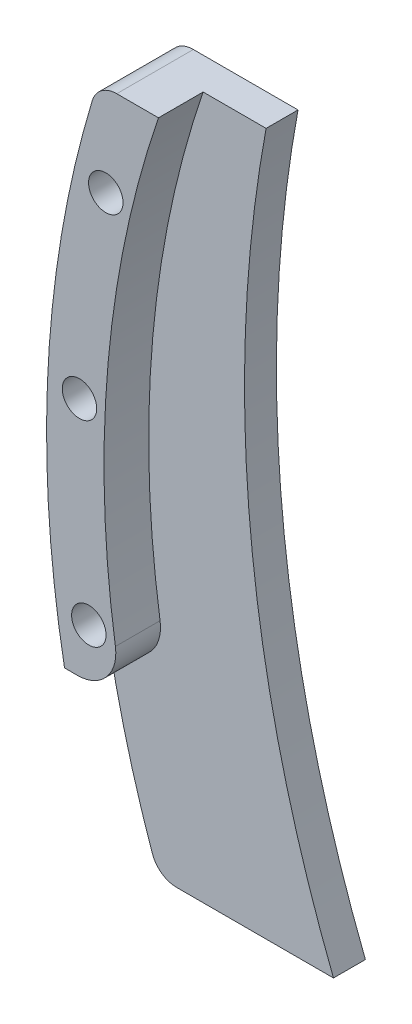
ISO-10303-21;
HEADER;
FILE_DESCRIPTION(('STEP AP214'),'2;1');
FILE_NAME('part.step','',(''),(''),'','','');
FILE_SCHEMA(('AUTOMOTIVE_DESIGN { 1 0 10303 214 1 1 1 1 }'));
ENDSEC;
DATA;
#1=APPLICATION_CONTEXT('core data for automotive mechanical design processes');
#2=APPLICATION_PROTOCOL_DEFINITION('international standard','automotive_design',2000,#1);
#3=PRODUCT_CONTEXT('',#1,'mechanical');
#4=PRODUCT('Part','Part','',(#3));
#5=PRODUCT_RELATED_PRODUCT_CATEGORY('part','',(#4));
#6=PRODUCT_DEFINITION_FORMATION('','',#4);
#7=PRODUCT_DEFINITION_CONTEXT('part definition',#1,'design');
#8=PRODUCT_DEFINITION('design','',#6,#7);
#9=PRODUCT_DEFINITION_SHAPE('','',#8);
#10=(LENGTH_UNIT() NAMED_UNIT(*) SI_UNIT(.MILLI.,.METRE.));
#11=(NAMED_UNIT(*) PLANE_ANGLE_UNIT() SI_UNIT($,.RADIAN.));
#12=(NAMED_UNIT(*) SI_UNIT($,.STERADIAN.) SOLID_ANGLE_UNIT());
#13=UNCERTAINTY_MEASURE_WITH_UNIT(LENGTH_MEASURE(1.E-05),#10,'distance_accuracy_value','');
#14=(GEOMETRIC_REPRESENTATION_CONTEXT(3) GLOBAL_UNCERTAINTY_ASSIGNED_CONTEXT((#13)) GLOBAL_UNIT_ASSIGNED_CONTEXT((#10,
#11,#12)) REPRESENTATION_CONTEXT('',''));
#15=CARTESIAN_POINT('',(0.,0.,0.));
#16=DIRECTION('',(0.,0.,1.));
#17=DIRECTION('',(1.,0.,0.));
#18=AXIS2_PLACEMENT_3D('',#15,#16,#17);
#19=CARTESIAN_POINT('',(0.,34.5634076532497,7.));
#20=DIRECTION('',(0.,1.,0.));
#21=DIRECTION('',(-1.,0.,0.));
#22=AXIS2_PLACEMENT_3D('',#19,#20,#21);
#23=PLANE('',#22);
#24=DIRECTION('',(-1.,0.,0.));
#25=VECTOR('',#24,1.);
#26=CARTESIAN_POINT('',(0.,34.5634076532497,-2.5));
#27=LINE('',#26,#25);
#28=CARTESIAN_POINT('',(1.32762574070365,34.5634076532497,-2.5));
#29=VERTEX_POINT('',#28);
#30=CARTESIAN_POINT('',(-10.9648148090118,34.5634076532497,-2.5));
#31=VERTEX_POINT('',#30);
#32=EDGE_CURVE('E170',#29,#31,#27,.T.);
#33=ORIENTED_EDGE('',*,*,#32,.T.);
#34=DIRECTION('',(0.,0.,1.));
#35=VECTOR('',#34,1.);
#36=CARTESIAN_POINT('',(-10.9648148090118,34.5634076532497,0.));
#37=LINE('',#36,#35);
#38=CARTESIAN_POINT('',(-10.9648148090118,34.5634076532497,-5.));
#39=VERTEX_POINT('',#38);
#40=EDGE_CURVE('E202',#31,#39,#37,.F.);
#41=ORIENTED_EDGE('',*,*,#40,.T.);
#42=DIRECTION('',(-1.,0.,0.));
#43=VECTOR('',#42,1.);
#44=CARTESIAN_POINT('',(0.,34.5634076532497,-5.));
#45=LINE('',#44,#43);
#46=CARTESIAN_POINT('',(1.32762574070365,34.5634076532497,-5.));
#47=VERTEX_POINT('',#46);
#48=EDGE_CURVE('E183',#47,#39,#45,.T.);
#49=ORIENTED_EDGE('',*,*,#48,.F.);
#50=DIRECTION('',(0.,0.,-1.));
#51=VECTOR('',#50,1.);
#52=CARTESIAN_POINT('',(1.32762574070365,34.5634076532497,-2.5));
#53=LINE('',#52,#51);
#54=EDGE_CURVE('E177',#29,#47,#53,.T.);
#55=ORIENTED_EDGE('',*,*,#54,.F.);
#56=EDGE_LOOP('',(#33,#41,#49,#55));
#57=FACE_BOUND('',#56,.T.);
#58=ADVANCED_FACE('F45',(#57),#23,.F.);
#59=CARTESIAN_POINT('',(66.3533376194957,63.8746380364105,63.0195151716117));
#60=DIRECTION('',(0.,0.,-1.));
#61=DIRECTION('',(-1.,0.,0.));
#62=AXIS2_PLACEMENT_3D('',#59,#60,#61);
#63=CYLINDRICAL_SURFACE('',#62,84.);
#64=DIRECTION('',(0.,0.,-1.));
#65=VECTOR('',#64,1.);
#66=CARTESIAN_POINT('',(-12.850623404829,35.8972800829287,63.0195151716117));
#67=LINE('',#66,#65);
#68=CARTESIAN_POINT('',(-12.850623404829,35.8972800829287,-5.));
#69=VERTEX_POINT('',#68);
#70=CARTESIAN_POINT('',(-12.8506234048291,35.8972800829287,-2.5));
#71=VERTEX_POINT('',#70);
#72=EDGE_CURVE('E206',#69,#71,#67,.F.);
#73=ORIENTED_EDGE('',*,*,#72,.T.);
#74=CARTESIAN_POINT('',(66.3533376194957,63.8746380364105,-2.5));
#75=DIRECTION('',(0.,0.,1.));
#76=DIRECTION('',(1.,0.,0.));
#77=AXIS2_PLACEMENT_3D('',#74,#75,#76);
#78=CIRCLE('',#77,84.);
#79=CARTESIAN_POINT('',(-16.2394358183407,48.5634076532497,-2.5));
#80=VERTEX_POINT('',#79);
#81=EDGE_CURVE('E127',#80,#71,#78,.T.);
#82=ORIENTED_EDGE('',*,*,#81,.F.);
#83=DIRECTION('',(0.,0.,-1.));
#84=VECTOR('',#83,1.);
#85=CARTESIAN_POINT('',(-16.2394358183407,48.5634076532497,16.4795946919343));
#86=LINE('',#85,#84);
#87=CARTESIAN_POINT('',(-16.2394358183407,48.5634076532497,1.));
#88=VERTEX_POINT('',#87);
#89=EDGE_CURVE('E122',#88,#80,#86,.T.);
#90=ORIENTED_EDGE('',*,*,#89,.F.);
#91=CARTESIAN_POINT('',(66.3533376194957,63.8746380364105,1.));
#92=DIRECTION('',(0.,0.,1.));
#93=DIRECTION('',(1.,0.,0.));
#94=AXIS2_PLACEMENT_3D('',#91,#92,#93);
#95=CIRCLE('',#94,84.);
#96=CARTESIAN_POINT('',(-14.0651603690342,88.1411825219531,1.));
#97=VERTEX_POINT('',#96);
#98=EDGE_CURVE('E126',#97,#88,#95,.T.);
#99=ORIENTED_EDGE('',*,*,#98,.F.);
#100=DIRECTION('',(0.,0.,-1.));
#101=VECTOR('',#100,1.);
#102=CARTESIAN_POINT('',(-14.0651603690342,88.1411825219531,63.0195151716117));
#103=LINE('',#102,#101);
#104=CARTESIAN_POINT('',(-14.0651603690342,88.1411825219531,-5.));
#105=VERTEX_POINT('',#104);
#106=EDGE_CURVE('E204',#97,#105,#103,.T.);
#107=ORIENTED_EDGE('',*,*,#106,.T.);
#108=CARTESIAN_POINT('',(66.3533376194957,63.8746380364105,-5.));
#109=DIRECTION('',(0.,0.,-1.));
#110=DIRECTION('',(-1.,0.,0.));
#111=AXIS2_PLACEMENT_3D('',#108,#109,#110);
#112=CIRCLE('',#111,84.);
#113=EDGE_CURVE('E191',#69,#105,#112,.T.);
#114=ORIENTED_EDGE('',*,*,#113,.F.);
#115=EDGE_LOOP('',(#73,#82,#90,#99,#107,#114));
#116=FACE_BOUND('',#115,.T.);
#117=ADVANCED_FACE('F124',(#116),#63,.T.);
#118=CARTESIAN_POINT('',(-10.9648148090118,36.5634076532497,63.0195151716117));
#119=DIRECTION('',(0.,0.,-1.));
#120=DIRECTION('',(-1.,0.,0.));
#121=AXIS2_PLACEMENT_3D('',#118,#119,#120);
#122=CYLINDRICAL_SURFACE('',#121,2.);
#123=ORIENTED_EDGE('',*,*,#40,.F.);
#124=CARTESIAN_POINT('',(-10.9648148090118,36.5634076532497,-2.5));
#125=DIRECTION('',(0.,0.,1.));
#126=DIRECTION('',(1.,0.,0.));
#127=AXIS2_PLACEMENT_3D('',#124,#125,#126);
#128=CIRCLE('',#127,2.);
#129=EDGE_CURVE('E128',#71,#31,#128,.T.);
#130=ORIENTED_EDGE('',*,*,#129,.F.);
#131=ORIENTED_EDGE('',*,*,#72,.F.);
#132=CARTESIAN_POINT('',(-10.9648148090118,36.5634076532497,-5.));
#133=DIRECTION('',(0.,0.,-1.));
#134=DIRECTION('',(-1.,0.,0.));
#135=AXIS2_PLACEMENT_3D('',#132,#133,#134);
#136=CIRCLE('',#135,2.);
#137=EDGE_CURVE('E188',#39,#69,#136,.T.);
#138=ORIENTED_EDGE('',*,*,#137,.F.);
#139=EDGE_LOOP('',(#123,#130,#131,#138));
#140=FACE_BOUND('',#139,.T.);
#141=ADVANCED_FACE('F235',(#140),#122,.T.);
#142=CARTESIAN_POINT('',(-8.35333621606578,89.5634076532497,63.0195151716117));
#143=DIRECTION('',(0.,1.,0.));
#144=DIRECTION('',(0.,0.,1.));
#145=AXIS2_PLACEMENT_3D('',#142,#143,#144);
#146=PLANE('',#145);
#147=DIRECTION('',(0.,0.,-1.));
#148=VECTOR('',#147,1.);
#149=CARTESIAN_POINT('',(-12.1504342264502,89.5634076532497,63.0195151716117));
#150=LINE('',#149,#148);
#151=CARTESIAN_POINT('',(-12.1504342264502,89.5634076532497,-5.));
#152=VERTEX_POINT('',#151);
#153=CARTESIAN_POINT('',(-12.1504342264502,89.5634076532497,1.));
#154=VERTEX_POINT('',#153);
#155=EDGE_CURVE('E208',#152,#154,#150,.F.);
#156=ORIENTED_EDGE('',*,*,#155,.T.);
#157=DIRECTION('',(-1.,0.,0.));
#158=VECTOR('',#157,1.);
#159=CARTESIAN_POINT('',(-8.88187431994768,89.5634076532497,1.));
#160=LINE('',#159,#158);
#161=CARTESIAN_POINT('',(-8.88187431994768,89.5634076532497,1.));
#162=VERTEX_POINT('',#161);
#163=EDGE_CURVE('E150',#162,#154,#160,.T.);
#164=ORIENTED_EDGE('',*,*,#163,.F.);
#165=DIRECTION('',(0.,0.,1.));
#166=VECTOR('',#165,1.);
#167=CARTESIAN_POINT('',(-8.88187431994769,89.5634076532497,-5.));
#168=LINE('',#167,#166);
#169=CARTESIAN_POINT('',(-8.88187431994769,89.5634076532497,-2.5));
#170=VERTEX_POINT('',#169);
#171=EDGE_CURVE('E199',#170,#162,#168,.T.);
#172=ORIENTED_EDGE('',*,*,#171,.F.);
#173=DIRECTION('',(1.,0.,0.));
#174=VECTOR('',#173,1.);
#175=CARTESIAN_POINT('',(6.06268631096199E-13,89.5634076532496,-2.5));
#176=LINE('',#175,#174);
#177=CARTESIAN_POINT('',(-3.94983203128654,89.5634076532496,-2.5));
#178=VERTEX_POINT('',#177);
#179=EDGE_CURVE('E174',#170,#178,#176,.T.);
#180=ORIENTED_EDGE('',*,*,#179,.T.);
#181=DIRECTION('',(0.,0.,-1.));
#182=VECTOR('',#181,1.);
#183=CARTESIAN_POINT('',(-3.94983203128654,89.5634076532496,-2.5));
#184=LINE('',#183,#182);
#185=CARTESIAN_POINT('',(-3.94983203128654,89.5634076532496,-5.));
#186=VERTEX_POINT('',#185);
#187=EDGE_CURVE('E180',#178,#186,#184,.T.);
#188=ORIENTED_EDGE('',*,*,#187,.T.);
#189=DIRECTION('',(1.,0.,0.));
#190=VECTOR('',#189,1.);
#191=CARTESIAN_POINT('',(0.,89.5634076532497,-5.));
#192=LINE('',#191,#190);
#193=EDGE_CURVE('E197',#152,#186,#192,.T.);
#194=ORIENTED_EDGE('',*,*,#193,.F.);
#195=EDGE_LOOP('',(#156,#164,#172,#180,#188,#194));
#196=FACE_BOUND('',#195,.T.);
#197=ADVANCED_FACE('F239',(#196),#146,.T.);
#198=CARTESIAN_POINT('',(-12.1504342264502,87.5634076532497,63.0195151716117));
#199=DIRECTION('',(0.,0.,-1.));
#200=DIRECTION('',(-1.,0.,0.));
#201=AXIS2_PLACEMENT_3D('',#198,#199,#200);
#202=CYLINDRICAL_SURFACE('',#201,2.);
#203=ORIENTED_EDGE('',*,*,#106,.F.);
#204=CARTESIAN_POINT('',(-12.1504342264502,87.5634076532497,1.));
#205=DIRECTION('',(0.,0.,1.));
#206=DIRECTION('',(1.,0.,0.));
#207=AXIS2_PLACEMENT_3D('',#204,#205,#206);
#208=CIRCLE('',#207,2.);
#209=EDGE_CURVE('E141',#154,#97,#208,.T.);
#210=ORIENTED_EDGE('',*,*,#209,.F.);
#211=ORIENTED_EDGE('',*,*,#155,.F.);
#212=CARTESIAN_POINT('',(-12.1504342264502,87.5634076532497,-5.));
#213=DIRECTION('',(0.,0.,-1.));
#214=DIRECTION('',(-1.,0.,0.));
#215=AXIS2_PLACEMENT_3D('',#212,#213,#214);
#216=CIRCLE('',#215,2.);
#217=EDGE_CURVE('E194',#105,#152,#216,.T.);
#218=ORIENTED_EDGE('',*,*,#217,.F.);
#219=EDGE_LOOP('',(#203,#210,#211,#218));
#220=FACE_BOUND('',#219,.T.);
#221=ADVANCED_FACE('F241',(#220),#202,.T.);
#222=CARTESIAN_POINT('',(66.3533376194957,63.8746380364105,-5.));
#223=DIRECTION('',(0.,0.,1.));
#224=DIRECTION('',(1.,0.,0.));
#225=AXIS2_PLACEMENT_3D('',#222,#223,#224);
#226=CYLINDRICAL_SURFACE('',#225,79.5);
#227=CARTESIAN_POINT('',(66.3533376194957,63.8746380364105,1.));
#228=DIRECTION('',(0.,0.,-1.));
#229=DIRECTION('',(1.,0.,0.));
#230=AXIS2_PLACEMENT_3D('',#227,#228,#229);
#231=CIRCLE('',#230,79.5);
#232=CARTESIAN_POINT('',(-12.2564976336131,52.0110887580919,1.));
#233=VERTEX_POINT('',#232);
#234=EDGE_CURVE('E134',#233,#162,#231,.T.);
#235=ORIENTED_EDGE('',*,*,#234,.F.);
#236=DIRECTION('',(0.,0.,1.));
#237=VECTOR('',#236,1.);
#238=CARTESIAN_POINT('',(-12.2564976336131,52.0110887580919,-5.));
#239=LINE('',#238,#237);
#240=CARTESIAN_POINT('',(-12.2564976336131,52.0110887580919,-2.5));
#241=VERTEX_POINT('',#240);
#242=EDGE_CURVE('E210',#233,#241,#239,.F.);
#243=ORIENTED_EDGE('',*,*,#242,.T.);
#244=CARTESIAN_POINT('',(66.3533376194957,63.8746380364105,-2.5));
#245=DIRECTION('',(0.,0.,-1.));
#246=DIRECTION('',(-1.,0.,0.));
#247=AXIS2_PLACEMENT_3D('',#244,#245,#246);
#248=CIRCLE('',#247,79.5);
#249=EDGE_CURVE('E172',#170,#241,#248,.F.);
#250=ORIENTED_EDGE('',*,*,#249,.F.);
#251=ORIENTED_EDGE('',*,*,#171,.T.);
#252=EDGE_LOOP('',(#235,#243,#250,#251));
#253=FACE_BOUND('',#252,.T.);
#254=ADVANCED_FACE('F217',(#253),#226,.F.);
#255=CARTESIAN_POINT('',(0.,0.,-5.));
#256=DIRECTION('',(0.,0.,-1.));
#257=DIRECTION('',(-1.,0.,0.));
#258=AXIS2_PLACEMENT_3D('',#255,#256,#257);
#259=PLANE('',#258);
#260=CARTESIAN_POINT('',(-13.0088572652672,82.4189639360738,-5.));
#261=DIRECTION('',(0.,0.,-1.));
#262=DIRECTION('',(-1.,0.,0.));
#263=AXIS2_PLACEMENT_3D('',#260,#261,#262);
#264=CIRCLE('',#263,1.35);
#265=CARTESIAN_POINT('',(-14.3588572652672,82.4189639360738,-5.));
#266=VERTEX_POINT('',#265);
#267=EDGE_CURVE('E159',#266,#266,#264,.T.);
#268=ORIENTED_EDGE('',*,*,#267,.F.);
#269=EDGE_LOOP('',(#268));
#270=FACE_BOUND('',#269,.T.);
#271=CARTESIAN_POINT('',(-15.0695569121837,67.4189639360738,-5.));
#272=DIRECTION('',(0.,0.,-1.));
#273=DIRECTION('',(-1.,0.,0.));
#274=AXIS2_PLACEMENT_3D('',#271,#272,#273);
#275=CIRCLE('',#274,1.35);
#276=CARTESIAN_POINT('',(-16.4195569121837,67.4189639360738,-5.));
#277=VERTEX_POINT('',#276);
#278=EDGE_CURVE('E156',#277,#277,#275,.T.);
#279=ORIENTED_EDGE('',*,*,#278,.F.);
#280=EDGE_LOOP('',(#279));
#281=FACE_BOUND('',#280,.T.);
#282=CARTESIAN_POINT('',(-14.337538760098,52.4189639360738,-5.));
#283=DIRECTION('',(0.,0.,-1.));
#284=DIRECTION('',(-1.,0.,0.));
#285=AXIS2_PLACEMENT_3D('',#282,#283,#284);
#286=CIRCLE('',#285,1.35);
#287=CARTESIAN_POINT('',(-15.687538760098,52.4189639360738,-5.));
#288=VERTEX_POINT('',#287);
#289=EDGE_CURVE('E153',#288,#288,#286,.T.);
#290=ORIENTED_EDGE('',*,*,#289,.F.);
#291=EDGE_LOOP('',(#290));
#292=FACE_BOUND('',#291,.T.);
#293=ORIENTED_EDGE('',*,*,#193,.T.);
#294=CARTESIAN_POINT('',(94.3576937723887,71.243190122889,-5.));
#295=DIRECTION('',(0.,0.,-1.));
#296=DIRECTION('',(-1.,0.,0.));
#297=AXIS2_PLACEMENT_3D('',#294,#295,#296);
#298=CIRCLE('',#297,100.);
#299=EDGE_CURVE('E166',#47,#186,#298,.T.);
#300=ORIENTED_EDGE('',*,*,#299,.F.);
#301=ORIENTED_EDGE('',*,*,#48,.T.);
#302=ORIENTED_EDGE('',*,*,#137,.T.);
#303=ORIENTED_EDGE('',*,*,#113,.T.);
#304=ORIENTED_EDGE('',*,*,#217,.T.);
#305=EDGE_LOOP('',(#293,#300,#301,#302,#303,#304));
#306=FACE_BOUND('',#305,.T.);
#307=ADVANCED_FACE('F249',(#270,#281,#292,#306),#259,.T.);
#308=CARTESIAN_POINT('',(94.3576937723887,71.243190122889,-2.5));
#309=DIRECTION('',(0.,0.,-1.));
#310=DIRECTION('',(-1.,0.,0.));
#311=AXIS2_PLACEMENT_3D('',#308,#309,#310);
#312=CYLINDRICAL_SURFACE('',#311,100.);
#313=ORIENTED_EDGE('',*,*,#299,.T.);
#314=ORIENTED_EDGE('',*,*,#187,.F.);
#315=CARTESIAN_POINT('',(94.3576937723887,71.243190122889,-2.5));
#316=DIRECTION('',(0.,0.,-1.));
#317=DIRECTION('',(-1.,0.,0.));
#318=AXIS2_PLACEMENT_3D('',#315,#316,#317);
#319=CIRCLE('',#318,100.);
#320=EDGE_CURVE('E168',#29,#178,#319,.T.);
#321=ORIENTED_EDGE('',*,*,#320,.F.);
#322=ORIENTED_EDGE('',*,*,#54,.T.);
#323=EDGE_LOOP('',(#313,#314,#321,#322));
#324=FACE_BOUND('',#323,.T.);
#325=ADVANCED_FACE('F266',(#324),#312,.F.);
#326=CARTESIAN_POINT('',(0.,0.,-2.5));
#327=DIRECTION('',(0.,0.,-1.));
#328=DIRECTION('',(-1.,0.,0.));
#329=AXIS2_PLACEMENT_3D('',#326,#327,#328);
#330=PLANE('',#329);
#331=ORIENTED_EDGE('',*,*,#320,.T.);
#332=ORIENTED_EDGE('',*,*,#179,.F.);
#333=ORIENTED_EDGE('',*,*,#249,.T.);
#334=CARTESIAN_POINT('',(-15.2229065110889,51.5634076532497,-2.5));
#335=DIRECTION('',(0.,0.,-1.));
#336=DIRECTION('',(-1.,0.,0.));
#337=AXIS2_PLACEMENT_3D('',#334,#335,#336);
#338=CIRCLE('',#337,3.);
#339=CARTESIAN_POINT('',(-15.2229065110889,48.5634076532497,-2.5));
#340=VERTEX_POINT('',#339);
#341=EDGE_CURVE('E12',#241,#340,#338,.T.);
#342=ORIENTED_EDGE('',*,*,#341,.T.);
#343=DIRECTION('',(1.,0.,0.));
#344=VECTOR('',#343,1.);
#345=CARTESIAN_POINT('',(0.,48.5634076532497,-2.5));
#346=LINE('',#345,#344);
#347=EDGE_CURVE('E162',#80,#340,#346,.T.);
#348=ORIENTED_EDGE('',*,*,#347,.F.);
#349=ORIENTED_EDGE('',*,*,#81,.T.);
#350=ORIENTED_EDGE('',*,*,#129,.T.);
#351=ORIENTED_EDGE('',*,*,#32,.F.);
#352=EDGE_LOOP('',(#331,#332,#333,#342,#348,#349,#350,#351));
#353=FACE_BOUND('',#352,.T.);
#354=ADVANCED_FACE('F261',(#353),#330,.F.);
#355=CARTESIAN_POINT('',(0.,48.5634076532497,16.4795946919343));
#356=DIRECTION('',(0.,1.,0.));
#357=DIRECTION('',(0.,0.,1.));
#358=AXIS2_PLACEMENT_3D('',#355,#356,#357);
#359=PLANE('',#358);
#360=ORIENTED_EDGE('',*,*,#347,.T.);
#361=DIRECTION('',(0.,0.,-1.));
#362=VECTOR('',#361,1.);
#363=CARTESIAN_POINT('',(-15.2229065110889,48.5634076532497,1.));
#364=LINE('',#363,#362);
#365=CARTESIAN_POINT('',(-15.2229065110889,48.5634076532497,1.));
#366=VERTEX_POINT('',#365);
#367=EDGE_CURVE('E60',#340,#366,#364,.F.);
#368=ORIENTED_EDGE('',*,*,#367,.T.);
#369=DIRECTION('',(1.,0.,0.));
#370=VECTOR('',#369,1.);
#371=CARTESIAN_POINT('',(-16.2394358183407,48.5634076532497,1.));
#372=LINE('',#371,#370);
#373=EDGE_CURVE('E130',#88,#366,#372,.T.);
#374=ORIENTED_EDGE('',*,*,#373,.F.);
#375=ORIENTED_EDGE('',*,*,#89,.T.);
#376=EDGE_LOOP('',(#360,#368,#374,#375));
#377=FACE_BOUND('',#376,.T.);
#378=ADVANCED_FACE('F131',(#377),#359,.F.);
#379=CARTESIAN_POINT('',(-14.337538760098,52.4189639360738,-10.));
#380=DIRECTION('',(0.,0.,1.));
#381=DIRECTION('',(1.,0.,0.));
#382=AXIS2_PLACEMENT_3D('',#379,#380,#381);
#383=CYLINDRICAL_SURFACE('',#382,1.35);
#384=ORIENTED_EDGE('',*,*,#289,.T.);
#385=EDGE_LOOP('',(#384));
#386=FACE_BOUND('',#385,.T.);
#387=CARTESIAN_POINT('',(-14.337538760098,52.4189639360738,1.));
#388=DIRECTION('',(0.,0.,1.));
#389=DIRECTION('',(1.,0.,0.));
#390=AXIS2_PLACEMENT_3D('',#387,#388,#389);
#391=CIRCLE('',#390,1.35);
#392=CARTESIAN_POINT('',(-12.987538760098,52.4189639360738,1.));
#393=VERTEX_POINT('',#392);
#394=EDGE_CURVE('E142',#393,#393,#391,.T.);
#395=ORIENTED_EDGE('',*,*,#394,.T.);
#396=EDGE_LOOP('',(#395));
#397=FACE_BOUND('',#396,.T.);
#398=ADVANCED_FACE('F278',(#386,#397),#383,.F.);
#399=CARTESIAN_POINT('',(-15.0695569121837,67.4189639360738,-10.));
#400=DIRECTION('',(0.,0.,1.));
#401=DIRECTION('',(1.,0.,0.));
#402=AXIS2_PLACEMENT_3D('',#399,#400,#401);
#403=CYLINDRICAL_SURFACE('',#402,1.35);
#404=ORIENTED_EDGE('',*,*,#278,.T.);
#405=EDGE_LOOP('',(#404));
#406=FACE_BOUND('',#405,.T.);
#407=CARTESIAN_POINT('',(-15.0695569121837,67.4189639360738,1.));
#408=DIRECTION('',(0.,0.,1.));
#409=DIRECTION('',(1.,0.,0.));
#410=AXIS2_PLACEMENT_3D('',#407,#408,#409);
#411=CIRCLE('',#410,1.35);
#412=CARTESIAN_POINT('',(-13.7195569121837,67.4189639360738,1.));
#413=VERTEX_POINT('',#412);
#414=EDGE_CURVE('E145',#413,#413,#411,.T.);
#415=ORIENTED_EDGE('',*,*,#414,.T.);
#416=EDGE_LOOP('',(#415));
#417=FACE_BOUND('',#416,.T.);
#418=ADVANCED_FACE('F280',(#406,#417),#403,.F.);
#419=CARTESIAN_POINT('',(-13.0088572652672,82.4189639360738,-10.));
#420=DIRECTION('',(0.,0.,1.));
#421=DIRECTION('',(1.,0.,0.));
#422=AXIS2_PLACEMENT_3D('',#419,#420,#421);
#423=CYLINDRICAL_SURFACE('',#422,1.35);
#424=ORIENTED_EDGE('',*,*,#267,.T.);
#425=EDGE_LOOP('',(#424));
#426=FACE_BOUND('',#425,.T.);
#427=CARTESIAN_POINT('',(-13.0088572652672,82.4189639360738,1.));
#428=DIRECTION('',(0.,0.,1.));
#429=DIRECTION('',(1.,0.,0.));
#430=AXIS2_PLACEMENT_3D('',#427,#428,#429);
#431=CIRCLE('',#430,1.35);
#432=CARTESIAN_POINT('',(-11.6588572652672,82.4189639360738,1.));
#433=VERTEX_POINT('',#432);
#434=EDGE_CURVE('E293',#433,#433,#431,.T.);
#435=ORIENTED_EDGE('',*,*,#434,.T.);
#436=EDGE_LOOP('',(#435));
#437=FACE_BOUND('',#436,.T.);
#438=ADVANCED_FACE('F224',(#426,#437),#423,.F.);
#439=CARTESIAN_POINT('',(66.3533376194957,63.8746380364105,1.));
#440=DIRECTION('',(0.,0.,1.));
#441=DIRECTION('',(1.,0.,0.));
#442=AXIS2_PLACEMENT_3D('',#439,#440,#441);
#443=PLANE('',#442);
#444=ORIENTED_EDGE('',*,*,#414,.F.);
#445=EDGE_LOOP('',(#444));
#446=FACE_BOUND('',#445,.T.);
#447=ORIENTED_EDGE('',*,*,#373,.T.);
#448=CARTESIAN_POINT('',(-15.2229065110889,51.5634076532497,1.));
#449=DIRECTION('',(0.,0.,1.));
#450=DIRECTION('',(1.,0.,0.));
#451=AXIS2_PLACEMENT_3D('',#448,#449,#450);
#452=CIRCLE('',#451,3.);
#453=EDGE_CURVE('E53',#366,#233,#452,.T.);
#454=ORIENTED_EDGE('',*,*,#453,.T.);
#455=ORIENTED_EDGE('',*,*,#234,.T.);
#456=ORIENTED_EDGE('',*,*,#163,.T.);
#457=ORIENTED_EDGE('',*,*,#209,.T.);
#458=ORIENTED_EDGE('',*,*,#98,.T.);
#459=EDGE_LOOP('',(#447,#454,#455,#456,#457,#458));
#460=FACE_BOUND('',#459,.T.);
#461=ORIENTED_EDGE('',*,*,#394,.F.);
#462=EDGE_LOOP('',(#461));
#463=FACE_BOUND('',#462,.T.);
#464=ORIENTED_EDGE('',*,*,#434,.F.);
#465=EDGE_LOOP('',(#464));
#466=FACE_BOUND('',#465,.T.);
#467=ADVANCED_FACE('F137',(#446,#460,#463,#466),#443,.T.);
#468=CARTESIAN_POINT('',(-15.2229065110889,51.5634076532497,-5.));
#469=DIRECTION('',(0.,0.,1.));
#470=DIRECTION('',(1.,0.,0.));
#471=AXIS2_PLACEMENT_3D('',#468,#469,#470);
#472=CYLINDRICAL_SURFACE('',#471,3.);
#473=ORIENTED_EDGE('',*,*,#453,.F.);
#474=ORIENTED_EDGE('',*,*,#367,.F.);
#475=ORIENTED_EDGE('',*,*,#341,.F.);
#476=ORIENTED_EDGE('',*,*,#242,.F.);
#477=EDGE_LOOP('',(#473,#474,#475,#476));
#478=FACE_BOUND('',#477,.T.);
#479=ADVANCED_FACE('F47',(#478),#472,.T.);
#480=CLOSED_SHELL('',(#58,#117,#141,#197,#221,#254,#307,#325,#354,#378,#398,#418,#438,#467,#479));
#481=MANIFOLD_SOLID_BREP('B2',#480);
#482=ADVANCED_BREP_SHAPE_REPRESENTATION('',(#18,#481),#14);
#483=SHAPE_DEFINITION_REPRESENTATION(#9,#482);
ENDSEC;
END-ISO-10303-21;
